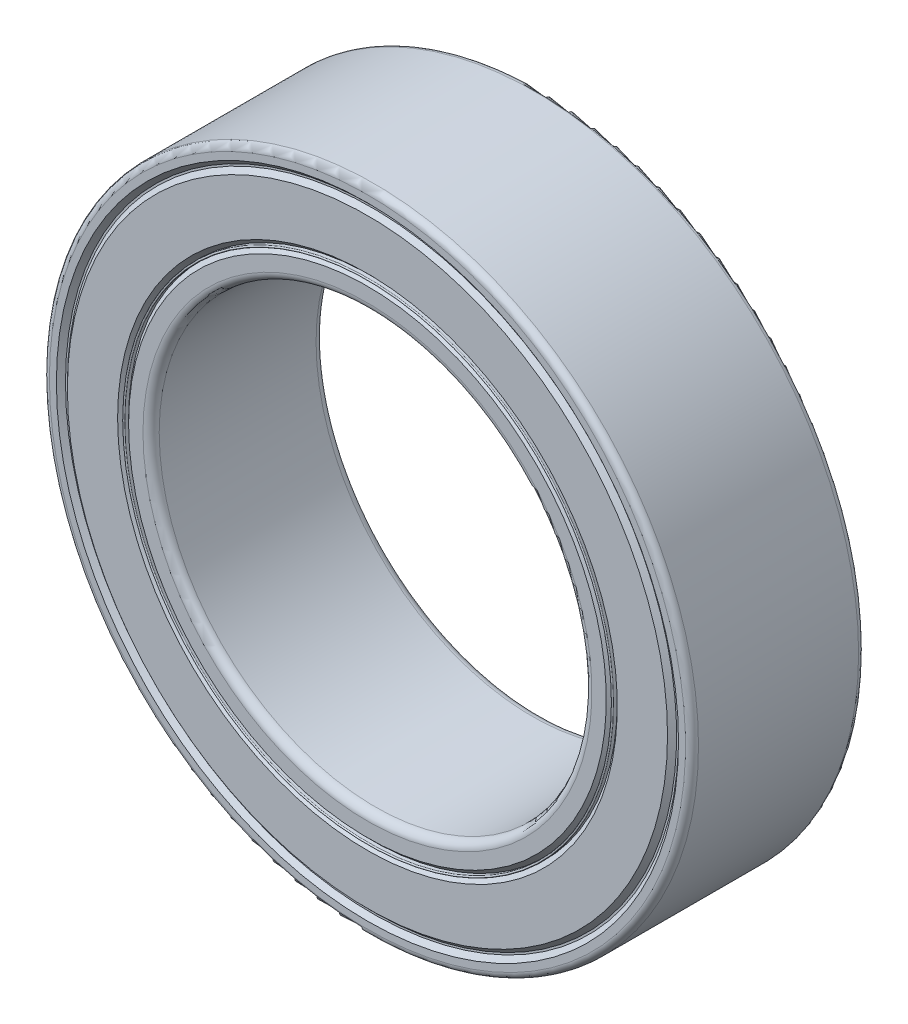
ISO-10303-21;
HEADER;
FILE_DESCRIPTION(('STEP AP214'),'2;1');
FILE_NAME('part.step','',(''),(''),'','','');
FILE_SCHEMA(('AUTOMOTIVE_DESIGN { 1 0 10303 214 1 1 1 1 }'));
ENDSEC;
DATA;
#1=APPLICATION_CONTEXT('core data for automotive mechanical design processes');
#2=APPLICATION_PROTOCOL_DEFINITION('international standard','automotive_design',2000,#1);
#3=PRODUCT_CONTEXT('',#1,'mechanical');
#4=PRODUCT('Part','Part','',(#3));
#5=PRODUCT_RELATED_PRODUCT_CATEGORY('part','',(#4));
#6=PRODUCT_DEFINITION_FORMATION('','',#4);
#7=PRODUCT_DEFINITION_CONTEXT('part definition',#1,'design');
#8=PRODUCT_DEFINITION('design','',#6,#7);
#9=PRODUCT_DEFINITION_SHAPE('','',#8);
#10=(LENGTH_UNIT() NAMED_UNIT(*) SI_UNIT(.MILLI.,.METRE.));
#11=(NAMED_UNIT(*) PLANE_ANGLE_UNIT() SI_UNIT($,.RADIAN.));
#12=(NAMED_UNIT(*) SI_UNIT($,.STERADIAN.) SOLID_ANGLE_UNIT());
#13=UNCERTAINTY_MEASURE_WITH_UNIT(LENGTH_MEASURE(1.E-05),#10,'distance_accuracy_value','');
#14=(GEOMETRIC_REPRESENTATION_CONTEXT(3) GLOBAL_UNCERTAINTY_ASSIGNED_CONTEXT((#13)) GLOBAL_UNIT_ASSIGNED_CONTEXT((#10,
#11,#12)) REPRESENTATION_CONTEXT('',''));
#15=CARTESIAN_POINT('',(0.,0.,0.));
#16=DIRECTION('',(0.,0.,1.));
#17=DIRECTION('',(1.,0.,0.));
#18=AXIS2_PLACEMENT_3D('',#15,#16,#17);
#19=CARTESIAN_POINT('',(0.,0.,-1.978125));
#20=DIRECTION('',(0.,0.,-1.));
#21=DIRECTION('',(-1.,0.,0.));
#22=AXIS2_PLACEMENT_3D('',#19,#20,#21);
#23=TOROIDAL_SURFACE('',#22,5.646875,0.0218750000000006);
#24=CARTESIAN_POINT('',(0.,0.,-1.978125));
#25=DIRECTION('',(0.,0.,-1.));
#26=DIRECTION('',(-1.,0.,0.));
#27=AXIS2_PLACEMENT_3D('',#24,#25,#26);
#28=CIRCLE('',#27,5.625);
#29=CARTESIAN_POINT('',(-5.625,0.,-1.978125));
#30=VERTEX_POINT('',#29);
#31=EDGE_CURVE('E68',#30,#30,#28,.T.);
#32=ORIENTED_EDGE('',*,*,#31,.F.);
#33=EDGE_LOOP('',(#32));
#34=FACE_BOUND('',#33,.T.);
#35=CARTESIAN_POINT('',(0.,0.,-1.978125));
#36=DIRECTION('',(0.,0.,-1.));
#37=DIRECTION('',(-1.,0.,0.));
#38=AXIS2_PLACEMENT_3D('',#35,#36,#37);
#39=CIRCLE('',#38,5.66875);
#40=CARTESIAN_POINT('',(-5.66875,0.,-1.978125));
#41=VERTEX_POINT('',#40);
#42=EDGE_CURVE('E11',#41,#41,#39,.T.);
#43=ORIENTED_EDGE('',*,*,#42,.T.);
#44=EDGE_LOOP('',(#43));
#45=FACE_BOUND('',#44,.T.);
#46=ADVANCED_FACE('F49',(#34,#45),#23,.T.);
#47=CARTESIAN_POINT('',(0.,0.,-2.));
#48=DIRECTION('',(0.,0.,-1.));
#49=DIRECTION('',(-1.,0.,0.));
#50=AXIS2_PLACEMENT_3D('',#47,#48,#49);
#51=CYLINDRICAL_SURFACE('',#50,5.66875);
#52=ORIENTED_EDGE('',*,*,#42,.F.);
#53=EDGE_LOOP('',(#52));
#54=FACE_BOUND('',#53,.T.);
#55=CARTESIAN_POINT('',(0.,0.,-1.895));
#56=DIRECTION('',(0.,0.,-1.));
#57=DIRECTION('',(-1.,0.,0.));
#58=AXIS2_PLACEMENT_3D('',#55,#56,#57);
#59=CIRCLE('',#58,5.66875);
#60=CARTESIAN_POINT('',(-5.66875,0.,-1.895));
#61=VERTEX_POINT('',#60);
#62=EDGE_CURVE('E60',#61,#61,#59,.T.);
#63=ORIENTED_EDGE('',*,*,#62,.T.);
#64=EDGE_LOOP('',(#63));
#65=FACE_BOUND('',#64,.T.);
#66=ADVANCED_FACE('F78',(#54,#65),#51,.T.);
#67=CARTESIAN_POINT('',(0.,-5.66875,-1.895));
#68=DIRECTION('',(0.,0.,-1.));
#69=DIRECTION('',(-1.,0.,0.));
#70=AXIS2_PLACEMENT_3D('',#67,#68,#69);
#71=PLANE('',#70);
#72=ORIENTED_EDGE('',*,*,#62,.F.);
#73=EDGE_LOOP('',(#72));
#74=FACE_BOUND('',#73,.T.);
#75=CARTESIAN_POINT('',(0.,0.,-1.895));
#76=DIRECTION('',(0.,0.,-1.));
#77=DIRECTION('',(-1.,0.,0.));
#78=AXIS2_PLACEMENT_3D('',#75,#76,#77);
#79=CIRCLE('',#78,5.625);
#80=CARTESIAN_POINT('',(-5.625,0.,-1.895));
#81=VERTEX_POINT('',#80);
#82=EDGE_CURVE('E64',#81,#81,#79,.T.);
#83=ORIENTED_EDGE('',*,*,#82,.T.);
#84=EDGE_LOOP('',(#83));
#85=FACE_BOUND('',#84,.T.);
#86=ADVANCED_FACE('F81',(#74,#85),#71,.F.);
#87=CARTESIAN_POINT('',(0.,0.,-2.));
#88=DIRECTION('',(0.,0.,-1.));
#89=DIRECTION('',(-1.,0.,0.));
#90=AXIS2_PLACEMENT_3D('',#87,#88,#89);
#91=CYLINDRICAL_SURFACE('',#90,5.625);
#92=ORIENTED_EDGE('',*,*,#82,.F.);
#93=EDGE_LOOP('',(#92));
#94=FACE_BOUND('',#93,.T.);
#95=ORIENTED_EDGE('',*,*,#31,.T.);
#96=EDGE_LOOP('',(#95));
#97=FACE_BOUND('',#96,.T.);
#98=ADVANCED_FACE('F80',(#94,#97),#91,.F.);
#99=CLOSED_SHELL('',(#46,#66,#86,#98));
#100=MANIFOLD_SOLID_BREP('B2',#99);
#101=CARTESIAN_POINT('',(0.,0.,-2.));
#102=DIRECTION('',(0.,0.,-1.));
#103=DIRECTION('',(-1.,0.,0.));
#104=AXIS2_PLACEMENT_3D('',#101,#102,#103);
#105=CYLINDRICAL_SURFACE('',#104,5.66875);
#106=CARTESIAN_POINT('',(0.,0.,1.895));
#107=DIRECTION('',(0.,0.,-1.));
#108=DIRECTION('',(-1.,0.,0.));
#109=AXIS2_PLACEMENT_3D('',#106,#107,#108);
#110=CIRCLE('',#109,5.66875);
#111=CARTESIAN_POINT('',(-5.66875,0.,1.895));
#112=VERTEX_POINT('',#111);
#113=EDGE_CURVE('E47',#112,#112,#110,.T.);
#114=ORIENTED_EDGE('',*,*,#113,.F.);
#115=EDGE_LOOP('',(#114));
#116=FACE_BOUND('',#115,.T.);
#117=CARTESIAN_POINT('',(0.,0.,1.978125));
#118=DIRECTION('',(0.,0.,-1.));
#119=DIRECTION('',(-1.,0.,0.));
#120=AXIS2_PLACEMENT_3D('',#117,#118,#119);
#121=CIRCLE('',#120,5.66875);
#122=CARTESIAN_POINT('',(-5.66875,0.,1.978125));
#123=VERTEX_POINT('',#122);
#124=EDGE_CURVE('E150',#123,#123,#121,.T.);
#125=ORIENTED_EDGE('',*,*,#124,.T.);
#126=EDGE_LOOP('',(#125));
#127=FACE_BOUND('',#126,.T.);
#128=ADVANCED_FACE('F129',(#116,#127),#105,.T.);
#129=CARTESIAN_POINT('',(0.,-5.66875,1.895));
#130=DIRECTION('',(0.,0.,1.));
#131=DIRECTION('',(1.,0.,0.));
#132=AXIS2_PLACEMENT_3D('',#129,#130,#131);
#133=PLANE('',#132);
#134=CARTESIAN_POINT('',(0.,0.,1.895));
#135=DIRECTION('',(0.,0.,-1.));
#136=DIRECTION('',(-1.,0.,0.));
#137=AXIS2_PLACEMENT_3D('',#134,#135,#136);
#138=CIRCLE('',#137,5.625);
#139=CARTESIAN_POINT('',(-5.625,0.,1.895));
#140=VERTEX_POINT('',#139);
#141=EDGE_CURVE('E134',#140,#140,#138,.T.);
#142=ORIENTED_EDGE('',*,*,#141,.F.);
#143=EDGE_LOOP('',(#142));
#144=FACE_BOUND('',#143,.T.);
#145=ORIENTED_EDGE('',*,*,#113,.T.);
#146=EDGE_LOOP('',(#145));
#147=FACE_BOUND('',#146,.T.);
#148=ADVANCED_FACE('F165',(#144,#147),#133,.F.);
#149=CARTESIAN_POINT('',(0.,0.,-2.));
#150=DIRECTION('',(0.,0.,-1.));
#151=DIRECTION('',(-1.,0.,0.));
#152=AXIS2_PLACEMENT_3D('',#149,#150,#151);
#153=CYLINDRICAL_SURFACE('',#152,5.625);
#154=CARTESIAN_POINT('',(0.,0.,1.978125));
#155=DIRECTION('',(0.,0.,-1.));
#156=DIRECTION('',(-1.,0.,0.));
#157=AXIS2_PLACEMENT_3D('',#154,#155,#156);
#158=CIRCLE('',#157,5.625);
#159=CARTESIAN_POINT('',(-5.625,0.,1.978125));
#160=VERTEX_POINT('',#159);
#161=EDGE_CURVE('E142',#160,#160,#158,.T.);
#162=ORIENTED_EDGE('',*,*,#161,.F.);
#163=EDGE_LOOP('',(#162));
#164=FACE_BOUND('',#163,.T.);
#165=ORIENTED_EDGE('',*,*,#141,.T.);
#166=EDGE_LOOP('',(#165));
#167=FACE_BOUND('',#166,.T.);
#168=ADVANCED_FACE('F157',(#164,#167),#153,.F.);
#169=CARTESIAN_POINT('',(0.,0.,1.978125));
#170=DIRECTION('',(0.,0.,-1.));
#171=DIRECTION('',(-1.,0.,0.));
#172=AXIS2_PLACEMENT_3D('',#169,#170,#171);
#173=TOROIDAL_SURFACE('',#172,5.646875,0.0218750000000006);
#174=ORIENTED_EDGE('',*,*,#124,.F.);
#175=EDGE_LOOP('',(#174));
#176=FACE_BOUND('',#175,.T.);
#177=ORIENTED_EDGE('',*,*,#161,.T.);
#178=EDGE_LOOP('',(#177));
#179=FACE_BOUND('',#178,.T.);
#180=ADVANCED_FACE('F158',(#176,#179),#173,.T.);
#181=CLOSED_SHELL('',(#128,#148,#168,#180));
#182=MANIFOLD_SOLID_BREP('B6',#181);
#183=CARTESIAN_POINT('',(0.,-7.03958333333334,-1.895));
#184=DIRECTION('',(0.,0.,1.));
#185=DIRECTION('',(1.,0.,0.));
#186=AXIS2_PLACEMENT_3D('',#183,#184,#185);
#187=PLANE('',#186);
#188=CARTESIAN_POINT('',(0.,0.,-1.895));
#189=DIRECTION('',(0.,0.,-1.));
#190=DIRECTION('',(-1.,0.,0.));
#191=AXIS2_PLACEMENT_3D('',#188,#189,#190);
#192=CIRCLE('',#191,7.03958333333334);
#193=CARTESIAN_POINT('',(-7.03958333333334,0.,-1.895));
#194=VERTEX_POINT('',#193);
#195=EDGE_CURVE('E243',#194,#194,#192,.T.);
#196=ORIENTED_EDGE('',*,*,#195,.F.);
#197=EDGE_LOOP('',(#196));
#198=FACE_BOUND('',#197,.T.);
#199=CARTESIAN_POINT('',(0.,0.,-1.895));
#200=DIRECTION('',(0.,0.,-1.));
#201=DIRECTION('',(-1.,0.,0.));
#202=AXIS2_PLACEMENT_3D('',#199,#200,#201);
#203=CIRCLE('',#202,7.08333333333334);
#204=CARTESIAN_POINT('',(-7.08333333333334,0.,-1.895));
#205=VERTEX_POINT('',#204);
#206=EDGE_CURVE('E130',#205,#205,#203,.T.);
#207=ORIENTED_EDGE('',*,*,#206,.T.);
#208=EDGE_LOOP('',(#207));
#209=FACE_BOUND('',#208,.T.);
#210=ADVANCED_FACE('F207',(#198,#209),#187,.F.);
#211=CARTESIAN_POINT('',(0.,0.,-2.));
#212=DIRECTION('',(0.,0.,-1.));
#213=DIRECTION('',(-1.,0.,0.));
#214=AXIS2_PLACEMENT_3D('',#211,#212,#213);
#215=CYLINDRICAL_SURFACE('',#214,7.08333333333334);
#216=ORIENTED_EDGE('',*,*,#206,.F.);
#217=EDGE_LOOP('',(#216));
#218=FACE_BOUND('',#217,.T.);
#219=CARTESIAN_POINT('',(0.,0.,-0.875000000000002));
#220=DIRECTION('',(0.,0.,-1.));
#221=DIRECTION('',(-1.,0.,0.));
#222=AXIS2_PLACEMENT_3D('',#219,#220,#221);
#223=CIRCLE('',#222,7.08333333333334);
#224=CARTESIAN_POINT('',(-7.08333333333334,0.,-0.875000000000002));
#225=VERTEX_POINT('',#224);
#226=EDGE_CURVE('E214',#225,#225,#223,.T.);
#227=ORIENTED_EDGE('',*,*,#226,.T.);
#228=EDGE_LOOP('',(#227));
#229=FACE_BOUND('',#228,.T.);
#230=ADVANCED_FACE('F255',(#218,#229),#215,.T.);
#231=CARTESIAN_POINT('',(0.,-7.08333333333334,-0.875000000000002));
#232=DIRECTION('',(0.,0.,-1.));
#233=DIRECTION('',(-1.,0.,0.));
#234=AXIS2_PLACEMENT_3D('',#231,#232,#233);
#235=PLANE('',#234);
#236=ORIENTED_EDGE('',*,*,#226,.F.);
#237=EDGE_LOOP('',(#236));
#238=FACE_BOUND('',#237,.T.);
#239=CARTESIAN_POINT('',(0.,0.,-0.875000000000002));
#240=DIRECTION('',(0.,0.,-1.));
#241=DIRECTION('',(-1.,0.,0.));
#242=AXIS2_PLACEMENT_3D('',#239,#240,#241);
#243=CIRCLE('',#242,5.625);
#244=CARTESIAN_POINT('',(-5.625,0.,-0.875000000000002));
#245=VERTEX_POINT('',#244);
#246=EDGE_CURVE('E218',#245,#245,#243,.T.);
#247=ORIENTED_EDGE('',*,*,#246,.T.);
#248=EDGE_LOOP('',(#247));
#249=FACE_BOUND('',#248,.T.);
#250=ADVANCED_FACE('F257',(#238,#249),#235,.F.);
#251=CARTESIAN_POINT('',(0.,0.,-2.));
#252=DIRECTION('',(0.,0.,-1.));
#253=DIRECTION('',(-1.,0.,0.));
#254=AXIS2_PLACEMENT_3D('',#251,#252,#253);
#255=CYLINDRICAL_SURFACE('',#254,5.625);
#256=ORIENTED_EDGE('',*,*,#246,.F.);
#257=EDGE_LOOP('',(#256));
#258=FACE_BOUND('',#257,.T.);
#259=CARTESIAN_POINT('',(0.,0.,-1.895));
#260=DIRECTION('',(0.,0.,-1.));
#261=DIRECTION('',(-1.,0.,0.));
#262=AXIS2_PLACEMENT_3D('',#259,#260,#261);
#263=CIRCLE('',#262,5.625);
#264=CARTESIAN_POINT('',(-5.625,0.,-1.895));
#265=VERTEX_POINT('',#264);
#266=EDGE_CURVE('E224',#265,#265,#263,.T.);
#267=ORIENTED_EDGE('',*,*,#266,.T.);
#268=EDGE_LOOP('',(#267));
#269=FACE_BOUND('',#268,.T.);
#270=ADVANCED_FACE('F261',(#258,#269),#255,.F.);
#271=CARTESIAN_POINT('',(0.,-5.66875,-1.895));
#272=DIRECTION('',(0.,0.,1.));
#273=DIRECTION('',(1.,0.,0.));
#274=AXIS2_PLACEMENT_3D('',#271,#272,#273);
#275=PLANE('',#274);
#276=ORIENTED_EDGE('',*,*,#266,.F.);
#277=EDGE_LOOP('',(#276));
#278=FACE_BOUND('',#277,.T.);
#279=CARTESIAN_POINT('',(0.,0.,-1.895));
#280=DIRECTION('',(0.,0.,-1.));
#281=DIRECTION('',(-1.,0.,0.));
#282=AXIS2_PLACEMENT_3D('',#279,#280,#281);
#283=CIRCLE('',#282,5.66875);
#284=CARTESIAN_POINT('',(-5.66875,0.,-1.895));
#285=VERTEX_POINT('',#284);
#286=EDGE_CURVE('E233',#285,#285,#283,.T.);
#287=ORIENTED_EDGE('',*,*,#286,.T.);
#288=EDGE_LOOP('',(#287));
#289=FACE_BOUND('',#288,.T.);
#290=ADVANCED_FACE('F270',(#278,#289),#275,.F.);
#291=CARTESIAN_POINT('',(0.,0.,-2.));
#292=DIRECTION('',(0.,0.,-1.));
#293=DIRECTION('',(-1.,0.,0.));
#294=AXIS2_PLACEMENT_3D('',#291,#292,#293);
#295=CONICAL_SURFACE('',#294,5.77375000000001,0.785398163397459);
#296=ORIENTED_EDGE('',*,*,#286,.F.);
#297=EDGE_LOOP('',(#296));
#298=FACE_BOUND('',#297,.T.);
#299=CARTESIAN_POINT('',(0.,0.,-2.));
#300=DIRECTION('',(0.,0.,-1.));
#301=DIRECTION('',(-1.,0.,0.));
#302=AXIS2_PLACEMENT_3D('',#299,#300,#301);
#303=CIRCLE('',#302,5.77375000000001);
#304=CARTESIAN_POINT('',(-5.77375000000001,0.,-2.));
#305=VERTEX_POINT('',#304);
#306=EDGE_CURVE('E232',#305,#305,#303,.T.);
#307=ORIENTED_EDGE('',*,*,#306,.T.);
#308=EDGE_LOOP('',(#307));
#309=FACE_BOUND('',#308,.T.);
#310=ADVANCED_FACE('F272',(#298,#309),#295,.F.);
#311=CARTESIAN_POINT('',(0.,-5.77375000000001,-2.));
#312=DIRECTION('',(0.,0.,1.));
#313=DIRECTION('',(1.,0.,0.));
#314=AXIS2_PLACEMENT_3D('',#311,#312,#313);
#315=PLANE('',#314);
#316=ORIENTED_EDGE('',*,*,#306,.F.);
#317=EDGE_LOOP('',(#316));
#318=FACE_BOUND('',#317,.T.);
#319=CARTESIAN_POINT('',(0.,0.,-2.));
#320=DIRECTION('',(0.,0.,-1.));
#321=DIRECTION('',(-1.,0.,0.));
#322=AXIS2_PLACEMENT_3D('',#319,#320,#321);
#323=CIRCLE('',#322,6.93458333333334);
#324=CARTESIAN_POINT('',(-6.93458333333334,0.,-2.));
#325=VERTEX_POINT('',#324);
#326=EDGE_CURVE('E237',#325,#325,#323,.T.);
#327=ORIENTED_EDGE('',*,*,#326,.T.);
#328=EDGE_LOOP('',(#327));
#329=FACE_BOUND('',#328,.T.);
#330=ADVANCED_FACE('F273',(#318,#329),#315,.F.);
#331=CARTESIAN_POINT('',(0.,0.,-1.895));
#332=DIRECTION('',(0.,0.,1.));
#333=DIRECTION('',(1.,0.,0.));
#334=AXIS2_PLACEMENT_3D('',#331,#332,#333);
#335=CONICAL_SURFACE('',#334,7.03958333333334,0.785398163397434);
#336=ORIENTED_EDGE('',*,*,#326,.F.);
#337=EDGE_LOOP('',(#336));
#338=FACE_BOUND('',#337,.T.);
#339=ORIENTED_EDGE('',*,*,#195,.T.);
#340=EDGE_LOOP('',(#339));
#341=FACE_BOUND('',#340,.T.);
#342=ADVANCED_FACE('F248',(#338,#341),#335,.T.);
#343=CLOSED_SHELL('',(#210,#230,#250,#270,#290,#310,#330,#342));
#344=MANIFOLD_SOLID_BREP('B42',#343);
#345=CARTESIAN_POINT('',(0.,0.,1.895));
#346=DIRECTION('',(0.,0.,1.));
#347=DIRECTION('',(1.,0.,0.));
#348=AXIS2_PLACEMENT_3D('',#345,#346,#347);
#349=CONICAL_SURFACE('',#348,5.66875,0.785398163397461);
#350=CARTESIAN_POINT('',(0.,0.,2.));
#351=DIRECTION('',(0.,0.,-1.));
#352=DIRECTION('',(-1.,0.,0.));
#353=AXIS2_PLACEMENT_3D('',#350,#351,#352);
#354=CIRCLE('',#353,5.77375000000001);
#355=CARTESIAN_POINT('',(-5.77375000000001,0.,2.));
#356=VERTEX_POINT('',#355);
#357=EDGE_CURVE('E390',#356,#356,#354,.T.);
#358=ORIENTED_EDGE('',*,*,#357,.F.);
#359=EDGE_LOOP('',(#358));
#360=FACE_BOUND('',#359,.T.);
#361=CARTESIAN_POINT('',(0.,0.,1.895));
#362=DIRECTION('',(0.,0.,-1.));
#363=DIRECTION('',(-1.,0.,0.));
#364=AXIS2_PLACEMENT_3D('',#361,#362,#363);
#365=CIRCLE('',#364,5.66875);
#366=CARTESIAN_POINT('',(-5.66875,0.,1.895));
#367=VERTEX_POINT('',#366);
#368=EDGE_CURVE('E201',#367,#367,#365,.T.);
#369=ORIENTED_EDGE('',*,*,#368,.T.);
#370=EDGE_LOOP('',(#369));
#371=FACE_BOUND('',#370,.T.);
#372=ADVANCED_FACE('F349',(#360,#371),#349,.F.);
#373=CARTESIAN_POINT('',(0.,-5.66875,1.895));
#374=DIRECTION('',(0.,0.,-1.));
#375=DIRECTION('',(-1.,0.,0.));
#376=AXIS2_PLACEMENT_3D('',#373,#374,#375);
#377=PLANE('',#376);
#378=ORIENTED_EDGE('',*,*,#368,.F.);
#379=EDGE_LOOP('',(#378));
#380=FACE_BOUND('',#379,.T.);
#381=CARTESIAN_POINT('',(0.,0.,1.895));
#382=DIRECTION('',(0.,0.,-1.));
#383=DIRECTION('',(-1.,0.,0.));
#384=AXIS2_PLACEMENT_3D('',#381,#382,#383);
#385=CIRCLE('',#384,5.625);
#386=CARTESIAN_POINT('',(-5.625,0.,1.895));
#387=VERTEX_POINT('',#386);
#388=EDGE_CURVE('E357',#387,#387,#385,.T.);
#389=ORIENTED_EDGE('',*,*,#388,.T.);
#390=EDGE_LOOP('',(#389));
#391=FACE_BOUND('',#390,.T.);
#392=ADVANCED_FACE('F397',(#380,#391),#377,.F.);
#393=CARTESIAN_POINT('',(0.,0.,-2.));
#394=DIRECTION('',(0.,0.,-1.));
#395=DIRECTION('',(-1.,0.,0.));
#396=AXIS2_PLACEMENT_3D('',#393,#394,#395);
#397=CYLINDRICAL_SURFACE('',#396,5.625);
#398=ORIENTED_EDGE('',*,*,#388,.F.);
#399=EDGE_LOOP('',(#398));
#400=FACE_BOUND('',#399,.T.);
#401=CARTESIAN_POINT('',(0.,0.,0.875000000000002));
#402=DIRECTION('',(0.,0.,-1.));
#403=DIRECTION('',(-1.,0.,0.));
#404=AXIS2_PLACEMENT_3D('',#401,#402,#403);
#405=CIRCLE('',#404,5.625);
#406=CARTESIAN_POINT('',(-5.625,0.,0.875000000000002));
#407=VERTEX_POINT('',#406);
#408=EDGE_CURVE('E361',#407,#407,#405,.T.);
#409=ORIENTED_EDGE('',*,*,#408,.T.);
#410=EDGE_LOOP('',(#409));
#411=FACE_BOUND('',#410,.T.);
#412=ADVANCED_FACE('F396',(#400,#411),#397,.F.);
#413=CARTESIAN_POINT('',(0.,-7.08333333333334,0.875000000000002));
#414=DIRECTION('',(0.,0.,1.));
#415=DIRECTION('',(1.,0.,0.));
#416=AXIS2_PLACEMENT_3D('',#413,#414,#415);
#417=PLANE('',#416);
#418=ORIENTED_EDGE('',*,*,#408,.F.);
#419=EDGE_LOOP('',(#418));
#420=FACE_BOUND('',#419,.T.);
#421=CARTESIAN_POINT('',(0.,0.,0.875000000000002));
#422=DIRECTION('',(0.,0.,-1.));
#423=DIRECTION('',(-1.,0.,0.));
#424=AXIS2_PLACEMENT_3D('',#421,#422,#423);
#425=CIRCLE('',#424,7.08333333333334);
#426=CARTESIAN_POINT('',(-7.08333333333334,0.,0.875000000000002));
#427=VERTEX_POINT('',#426);
#428=EDGE_CURVE('E367',#427,#427,#425,.T.);
#429=ORIENTED_EDGE('',*,*,#428,.T.);
#430=EDGE_LOOP('',(#429));
#431=FACE_BOUND('',#430,.T.);
#432=ADVANCED_FACE('F403',(#420,#431),#417,.F.);
#433=CARTESIAN_POINT('',(0.,0.,-2.));
#434=DIRECTION('',(0.,0.,-1.));
#435=DIRECTION('',(-1.,0.,0.));
#436=AXIS2_PLACEMENT_3D('',#433,#434,#435);
#437=CYLINDRICAL_SURFACE('',#436,7.08333333333334);
#438=ORIENTED_EDGE('',*,*,#428,.F.);
#439=EDGE_LOOP('',(#438));
#440=FACE_BOUND('',#439,.T.);
#441=CARTESIAN_POINT('',(0.,0.,1.895));
#442=DIRECTION('',(0.,0.,-1.));
#443=DIRECTION('',(-1.,0.,0.));
#444=AXIS2_PLACEMENT_3D('',#441,#442,#443);
#445=CIRCLE('',#444,7.08333333333334);
#446=CARTESIAN_POINT('',(-7.08333333333334,0.,1.895));
#447=VERTEX_POINT('',#446);
#448=EDGE_CURVE('E374',#447,#447,#445,.T.);
#449=ORIENTED_EDGE('',*,*,#448,.T.);
#450=EDGE_LOOP('',(#449));
#451=FACE_BOUND('',#450,.T.);
#452=ADVANCED_FACE('F411',(#440,#451),#437,.T.);
#453=CARTESIAN_POINT('',(0.,-7.03958333333334,1.895));
#454=DIRECTION('',(0.,0.,-1.));
#455=DIRECTION('',(-1.,0.,0.));
#456=AXIS2_PLACEMENT_3D('',#453,#454,#455);
#457=PLANE('',#456);
#458=ORIENTED_EDGE('',*,*,#448,.F.);
#459=EDGE_LOOP('',(#458));
#460=FACE_BOUND('',#459,.T.);
#461=CARTESIAN_POINT('',(0.,0.,1.895));
#462=DIRECTION('',(0.,0.,-1.));
#463=DIRECTION('',(-1.,0.,0.));
#464=AXIS2_PLACEMENT_3D('',#461,#462,#463);
#465=CIRCLE('',#464,7.03958333333334);
#466=CARTESIAN_POINT('',(-7.03958333333334,0.,1.895));
#467=VERTEX_POINT('',#466);
#468=EDGE_CURVE('E378',#467,#467,#465,.T.);
#469=ORIENTED_EDGE('',*,*,#468,.T.);
#470=EDGE_LOOP('',(#469));
#471=FACE_BOUND('',#470,.T.);
#472=ADVANCED_FACE('F414',(#460,#471),#457,.F.);
#473=CARTESIAN_POINT('',(0.,0.,2.));
#474=DIRECTION('',(0.,0.,-1.));
#475=DIRECTION('',(-1.,0.,0.));
#476=AXIS2_PLACEMENT_3D('',#473,#474,#475);
#477=CONICAL_SURFACE('',#476,6.93458333333334,0.785398163397436);
#478=ORIENTED_EDGE('',*,*,#468,.F.);
#479=EDGE_LOOP('',(#478));
#480=FACE_BOUND('',#479,.T.);
#481=CARTESIAN_POINT('',(0.,0.,2.));
#482=DIRECTION('',(0.,0.,-1.));
#483=DIRECTION('',(-1.,0.,0.));
#484=AXIS2_PLACEMENT_3D('',#481,#482,#483);
#485=CIRCLE('',#484,6.93458333333334);
#486=CARTESIAN_POINT('',(-6.93458333333334,0.,2.));
#487=VERTEX_POINT('',#486);
#488=EDGE_CURVE('E384',#487,#487,#485,.T.);
#489=ORIENTED_EDGE('',*,*,#488,.T.);
#490=EDGE_LOOP('',(#489));
#491=FACE_BOUND('',#490,.T.);
#492=ADVANCED_FACE('F417',(#480,#491),#477,.T.);
#493=CARTESIAN_POINT('',(0.,-5.77375000000001,2.));
#494=DIRECTION('',(0.,0.,-1.));
#495=DIRECTION('',(-1.,0.,0.));
#496=AXIS2_PLACEMENT_3D('',#493,#494,#495);
#497=PLANE('',#496);
#498=ORIENTED_EDGE('',*,*,#488,.F.);
#499=EDGE_LOOP('',(#498));
#500=FACE_BOUND('',#499,.T.);
#501=ORIENTED_EDGE('',*,*,#357,.T.);
#502=EDGE_LOOP('',(#501));
#503=FACE_BOUND('',#502,.T.);
#504=ADVANCED_FACE('F392',(#500,#503),#497,.F.);
#505=CLOSED_SHELL('',(#372,#392,#412,#432,#452,#472,#492,#504));
#506=MANIFOLD_SOLID_BREP('B125',#505);
#507=CARTESIAN_POINT('',(2.58447241954408,-5.8048200954374,0.));
#508=DIRECTION('',(-0.406736643075789,0.913545457642606,0.));
#509=DIRECTION('',(0.,0.,-1.));
#510=AXIS2_PLACEMENT_3D('',#507,#508,#509);
#511=SPHERICAL_SURFACE('',#510,0.875000000000003);
#512=CARTESIAN_POINT('',(2.22857785685276,-5.00546782000011,0.));
#513=VERTEX_POINT('',#512);
#514=VERTEX_LOOP('',#513);
#515=FACE_BOUND('',#514,.T.);
#516=ADVANCED_FACE('F494',(#515),#511,.T.);
#517=CLOSED_SHELL('',(#516));
#518=MANIFOLD_SOLID_BREP('B199',#517);
#519=CARTESIAN_POINT('',(4.72206607855423,-4.25176739457197,0.));
#520=DIRECTION('',(-0.743144825477386,0.669130606358867,0.));
#521=DIRECTION('',(0.,0.,-1.));
#522=AXIS2_PLACEMENT_3D('',#519,#520,#521);
#523=SPHERICAL_SURFACE('',#522,0.875000000000003);
#524=CARTESIAN_POINT('',(4.07181435626151,-3.66627811400796,0.));
#525=VERTEX_POINT('',#524);
#526=VERTEX_LOOP('',#525);
#527=FACE_BOUND('',#526,.T.);
#528=ADVANCED_FACE('F514',(#527),#523,.T.);
#529=CLOSED_SHELL('',(#528));
#530=MANIFOLD_SOLID_BREP('B346',#529);
#531=CARTESIAN_POINT('',(6.04317161395877,-1.96354548509088,0.));
#532=DIRECTION('',(-0.95105651629515,0.309016994374957,0.));
#533=DIRECTION('',(0.,0.,-1.));
#534=AXIS2_PLACEMENT_3D('',#531,#532,#533);
#535=SPHERICAL_SURFACE('',#534,0.875000000000003);
#536=CARTESIAN_POINT('',(5.21099716220051,-1.69315561501279,0.));
#537=VERTEX_POINT('',#536);
#538=VERTEX_LOOP('',#537);
#539=FACE_BOUND('',#538,.T.);
#540=ADVANCED_FACE('F535',(#539),#535,.T.);
#541=CLOSED_SHELL('',(#540));
#542=MANIFOLD_SOLID_BREP('B489',#541);
#543=CARTESIAN_POINT('',(6.31935787681925,0.664191277013153,0.));
#544=DIRECTION('',(-0.994521895368274,-0.104528463267644,0.));
#545=DIRECTION('',(0.,0.,-1.));
#546=AXIS2_PLACEMENT_3D('',#543,#544,#545);
#547=SPHERICAL_SURFACE('',#546,0.875000000000003);
#548=CARTESIAN_POINT('',(5.449151218372,0.572728871653964,0.));
#549=VERTEX_POINT('',#548);
#550=VERTEX_LOOP('',#549);
#551=FACE_BOUND('',#550,.T.);
#552=ADVANCED_FACE('F553',(#551),#547,.T.);
#553=CLOSED_SHELL('',(#552));
#554=MANIFOLD_SOLID_BREP('B508',#553);
#555=CARTESIAN_POINT('',(5.50286975321365,3.17708333333328,0.));
#556=DIRECTION('',(-0.866025403784443,-0.499999999999992,0.));
#557=DIRECTION('',(0.,0.,-1.));
#558=AXIS2_PLACEMENT_3D('',#555,#556,#557);
#559=SPHERICAL_SURFACE('',#558,0.875000000000003);
#560=CARTESIAN_POINT('',(4.74509752490226,2.73958333333329,0.));
#561=VERTEX_POINT('',#560);
#562=VERTEX_LOOP('',#561);
#563=FACE_BOUND('',#562,.T.);
#564=ADVANCED_FACE('F569',(#563),#559,.T.);
#565=CLOSED_SHELL('',(#564));
#566=MANIFOLD_SOLID_BREP('B528',#565);
#567=CARTESIAN_POINT('',(3.73488545727513,5.14062881842412,0.));
#568=DIRECTION('',(-0.58778525229248,-0.809016994374943,0.));
#569=DIRECTION('',(0.,0.,-1.));
#570=AXIS2_PLACEMENT_3D('',#567,#568,#569);
#571=SPHERICAL_SURFACE('',#570,0.875000000000003);
#572=CARTESIAN_POINT('',(3.22057336151921,4.43273894834604,0.));
#573=VERTEX_POINT('',#572);
#574=VERTEX_LOOP('',#573);
#575=FACE_BOUND('',#574,.T.);
#576=ADVANCED_FACE('F588',(#575),#571,.T.);
#577=CLOSED_SHELL('',(#576));
#578=MANIFOLD_SOLID_BREP('B550',#577);
#579=CARTESIAN_POINT('',(1.32110553540456,6.21531287966272,0.));
#580=DIRECTION('',(-0.207911690817766,-0.978147600733804,0.));
#581=DIRECTION('',(0.,0.,-1.));
#582=AXIS2_PLACEMENT_3D('',#579,#580,#581);
#583=SPHERICAL_SURFACE('',#582,0.875000000000003);
#584=CARTESIAN_POINT('',(1.13918280593901,5.35943372902064,0.));
#585=VERTEX_POINT('',#584);
#586=VERTEX_LOOP('',#585);
#587=FACE_BOUND('',#586,.T.);
#588=ADVANCED_FACE('F607',(#587),#583,.T.);
#589=CLOSED_SHELL('',(#588));
#590=MANIFOLD_SOLID_BREP('B566',#589);
#591=CARTESIAN_POINT('',(-1.32110553540447,6.21531287966273,0.));
#592=DIRECTION('',(0.207911690817753,-0.978147600733807,0.));
#593=DIRECTION('',(0.,0.,-1.));
#594=AXIS2_PLACEMENT_3D('',#591,#592,#593);
#595=SPHERICAL_SURFACE('',#594,0.875000000000003);
#596=CARTESIAN_POINT('',(-1.13918280593894,5.35943372902065,0.));
#597=VERTEX_POINT('',#596);
#598=VERTEX_LOOP('',#597);
#599=FACE_BOUND('',#598,.T.);
#600=ADVANCED_FACE('F630',(#599),#595,.T.);
#601=CLOSED_SHELL('',(#600));
#602=MANIFOLD_SOLID_BREP('B583',#601);
#603=CARTESIAN_POINT('',(-3.73488545727506,5.14062881842417,0.));
#604=DIRECTION('',(0.587785252292469,-0.80901699437495,0.));
#605=DIRECTION('',(0.,0.,-1.));
#606=AXIS2_PLACEMENT_3D('',#603,#604,#605);
#607=SPHERICAL_SURFACE('',#606,0.875000000000003);
#608=CARTESIAN_POINT('',(-3.22057336151915,4.43273894834608,0.));
#609=VERTEX_POINT('',#608);
#610=VERTEX_LOOP('',#609);
#611=FACE_BOUND('',#610,.T.);
#612=ADVANCED_FACE('F647',(#611),#607,.T.);
#613=CLOSED_SHELL('',(#612));
#614=MANIFOLD_SOLID_BREP('B601',#613);
#615=CARTESIAN_POINT('',(-5.50286975321361,3.17708333333336,0.));
#616=DIRECTION('',(0.866025403784436,-0.500000000000004,0.));
#617=DIRECTION('',(0.,0.,-1.));
#618=AXIS2_PLACEMENT_3D('',#615,#616,#617);
#619=SPHERICAL_SURFACE('',#618,0.875000000000003);
#620=CARTESIAN_POINT('',(-4.74509752490222,2.73958333333336,0.));
#621=VERTEX_POINT('',#620);
#622=VERTEX_LOOP('',#621);
#623=FACE_BOUND('',#622,.T.);
#624=ADVANCED_FACE('F663',(#623),#619,.T.);
#625=CLOSED_SHELL('',(#624));
#626=MANIFOLD_SOLID_BREP('B621',#625);
#627=CARTESIAN_POINT('',(-6.31935787681924,0.664191277013238,0.));
#628=DIRECTION('',(0.994521895368273,-0.104528463267657,0.));
#629=DIRECTION('',(0.,0.,-1.));
#630=AXIS2_PLACEMENT_3D('',#627,#628,#629);
#631=SPHERICAL_SURFACE('',#630,0.875000000000003);
#632=CARTESIAN_POINT('',(-5.44915121837199,0.572728871654038,0.));
#633=VERTEX_POINT('',#632);
#634=VERTEX_LOOP('',#633);
#635=FACE_BOUND('',#634,.T.);
#636=ADVANCED_FACE('F685',(#635),#631,.T.);
#637=CLOSED_SHELL('',(#636));
#638=MANIFOLD_SOLID_BREP('B645',#637);
#639=CARTESIAN_POINT('',(-6.0431716139588,-1.9635454850908,0.));
#640=DIRECTION('',(0.951056516295154,0.309016994374945,0.));
#641=DIRECTION('',(0.,0.,-1.));
#642=AXIS2_PLACEMENT_3D('',#639,#640,#641);
#643=SPHERICAL_SURFACE('',#642,0.875000000000003);
#644=CARTESIAN_POINT('',(-5.21099716220053,-1.69315561501272,0.));
#645=VERTEX_POINT('',#644);
#646=VERTEX_LOOP('',#645);
#647=FACE_BOUND('',#646,.T.);
#648=ADVANCED_FACE('F702',(#647),#643,.T.);
#649=CLOSED_SHELL('',(#648));
#650=MANIFOLD_SOLID_BREP('B662',#649);
#651=CARTESIAN_POINT('',(-4.72206607855429,-4.25176739457191,0.));
#652=DIRECTION('',(0.743144825477395,0.669130606358857,0.));
#653=DIRECTION('',(0.,0.,-1.));
#654=AXIS2_PLACEMENT_3D('',#651,#652,#653);
#655=SPHERICAL_SURFACE('',#654,0.875000000000003);
#656=CARTESIAN_POINT('',(-4.07181435626156,-3.6662781140079,0.));
#657=VERTEX_POINT('',#656);
#658=VERTEX_LOOP('',#657);
#659=FACE_BOUND('',#658,.T.);
#660=ADVANCED_FACE('F725',(#659),#655,.T.);
#661=CLOSED_SHELL('',(#660));
#662=MANIFOLD_SOLID_BREP('B679',#661);
#663=CARTESIAN_POINT('',(-2.58447241954415,-5.80482009543736,0.));
#664=DIRECTION('',(0.406736643075801,0.913545457642601,0.));
#665=DIRECTION('',(0.,0.,-1.));
#666=AXIS2_PLACEMENT_3D('',#663,#664,#665);
#667=SPHERICAL_SURFACE('',#666,0.875000000000003);
#668=CARTESIAN_POINT('',(-2.22857785685283,-5.00546782000008,0.));
#669=VERTEX_POINT('',#668);
#670=VERTEX_LOOP('',#669);
#671=FACE_BOUND('',#670,.T.);
#672=ADVANCED_FACE('F743',(#671),#667,.T.);
#673=CLOSED_SHELL('',(#672));
#674=MANIFOLD_SOLID_BREP('B697',#673);
#675=CARTESIAN_POINT('',(0.,-6.35416666666667,0.));
#676=DIRECTION('',(0.,1.,0.));
#677=DIRECTION('',(0.,0.,-1.));
#678=AXIS2_PLACEMENT_3D('',#675,#676,#677);
#679=SPHERICAL_SURFACE('',#678,0.875000000000003);
#680=CARTESIAN_POINT('',(0.,-5.47916666666667,0.));
#681=VERTEX_POINT('',#680);
#682=VERTEX_LOOP('',#681);
#683=FACE_BOUND('',#682,.T.);
#684=ADVANCED_FACE('F765',(#683),#679,.T.);
#685=CLOSED_SHELL('',(#684));
#686=MANIFOLD_SOLID_BREP('B717',#685);
#687=CARTESIAN_POINT('',(0.,0.,-2.));
#688=DIRECTION('',(0.,0.,-1.));
#689=DIRECTION('',(-1.,0.,0.));
#690=AXIS2_PLACEMENT_3D('',#687,#688,#689);
#691=CYLINDRICAL_SURFACE('',#690,5.625);
#692=CARTESIAN_POINT('',(0.,0.,-1.895));
#693=DIRECTION('',(0.,0.,1.));
#694=DIRECTION('',(1.,0.,0.));
#695=AXIS2_PLACEMENT_3D('',#692,#693,#694);
#696=CIRCLE('',#695,5.625);
#697=CARTESIAN_POINT('',(5.625,0.,-1.895));
#698=VERTEX_POINT('',#697);
#699=EDGE_CURVE('E797',#698,#698,#696,.T.);
#700=ORIENTED_EDGE('',*,*,#699,.T.);
#701=EDGE_LOOP('',(#700));
#702=FACE_BOUND('',#701,.T.);
#703=CARTESIAN_POINT('',(0.,0.,-0.483674448593496));
#704=DIRECTION('',(0.,0.,1.));
#705=DIRECTION('',(1.,0.,0.));
#706=AXIS2_PLACEMENT_3D('',#703,#704,#705);
#707=CIRCLE('',#706,5.625);
#708=CARTESIAN_POINT('',(5.625,0.,-0.483674448593496));
#709=VERTEX_POINT('',#708);
#710=EDGE_CURVE('E822',#709,#709,#707,.T.);
#711=ORIENTED_EDGE('',*,*,#710,.F.);
#712=EDGE_LOOP('',(#711));
#713=FACE_BOUND('',#712,.T.);
#714=ADVANCED_FACE('F785',(#702,#713),#691,.T.);
#715=CARTESIAN_POINT('',(0.,0.,1.895));
#716=DIRECTION('',(0.,0.,-1.));
#717=DIRECTION('',(-1.,0.,0.));
#718=AXIS2_PLACEMENT_3D('',#715,#716,#717);
#719=CIRCLE('',#718,5.625);
#720=CARTESIAN_POINT('',(-5.625,0.,1.895));
#721=VERTEX_POINT('',#720);
#722=EDGE_CURVE('E786',#721,#721,#719,.T.);
#723=ORIENTED_EDGE('',*,*,#722,.T.);
#724=EDGE_LOOP('',(#723));
#725=FACE_BOUND('',#724,.T.);
#726=CARTESIAN_POINT('',(0.,0.,0.483674448593496));
#727=DIRECTION('',(0.,0.,-1.));
#728=DIRECTION('',(-1.,0.,0.));
#729=AXIS2_PLACEMENT_3D('',#726,#727,#728);
#730=CIRCLE('',#729,5.625);
#731=CARTESIAN_POINT('',(-5.625,0.,0.483674448593496));
#732=VERTEX_POINT('',#731);
#733=EDGE_CURVE('E828',#732,#732,#730,.T.);
#734=ORIENTED_EDGE('',*,*,#733,.F.);
#735=EDGE_LOOP('',(#734));
#736=FACE_BOUND('',#735,.T.);
#737=ADVANCED_FACE('F840',(#725,#736),#691,.T.);
#738=CARTESIAN_POINT('',(0.,-5.625,2.));
#739=DIRECTION('',(0.,0.,-1.));
#740=DIRECTION('',(-1.,0.,0.));
#741=AXIS2_PLACEMENT_3D('',#738,#739,#740);
#742=PLANE('',#741);
#743=CARTESIAN_POINT('',(0.,0.,2.));
#744=DIRECTION('',(0.,0.,-1.));
#745=DIRECTION('',(-1.,0.,0.));
#746=AXIS2_PLACEMENT_3D('',#743,#744,#745);
#747=CIRCLE('',#746,5.52);
#748=CARTESIAN_POINT('',(-5.52,0.,2.));
#749=VERTEX_POINT('',#748);
#750=EDGE_CURVE('E761',#749,#749,#747,.F.);
#751=ORIENTED_EDGE('',*,*,#750,.T.);
#752=EDGE_LOOP('',(#751));
#753=FACE_BOUND('',#752,.T.);
#754=CARTESIAN_POINT('',(0.,0.,2.));
#755=DIRECTION('',(0.,0.,-1.));
#756=DIRECTION('',(-1.,0.,0.));
#757=AXIS2_PLACEMENT_3D('',#754,#755,#756);
#758=CIRCLE('',#757,5.1875);
#759=CARTESIAN_POINT('',(-5.1875,0.,2.));
#760=VERTEX_POINT('',#759);
#761=EDGE_CURVE('E806',#760,#760,#758,.T.);
#762=ORIENTED_EDGE('',*,*,#761,.T.);
#763=EDGE_LOOP('',(#762));
#764=FACE_BOUND('',#763,.T.);
#765=ADVANCED_FACE('F836',(#753,#764),#742,.F.);
#766=CARTESIAN_POINT('',(0.,0.,-2.));
#767=DIRECTION('',(0.,0.,-1.));
#768=DIRECTION('',(-1.,0.,0.));
#769=AXIS2_PLACEMENT_3D('',#766,#767,#768);
#770=CYLINDRICAL_SURFACE('',#769,5.);
#771=CARTESIAN_POINT('',(0.,0.,-1.8125));
#772=DIRECTION('',(0.,0.,1.));
#773=DIRECTION('',(1.,0.,0.));
#774=AXIS2_PLACEMENT_3D('',#771,#772,#773);
#775=CIRCLE('',#774,5.);
#776=CARTESIAN_POINT('',(5.,0.,-1.8125));
#777=VERTEX_POINT('',#776);
#778=EDGE_CURVE('E818',#777,#777,#775,.F.);
#779=ORIENTED_EDGE('',*,*,#778,.T.);
#780=EDGE_LOOP('',(#779));
#781=FACE_BOUND('',#780,.T.);
#782=CARTESIAN_POINT('',(0.,0.,1.8125));
#783=DIRECTION('',(0.,0.,-1.));
#784=DIRECTION('',(-1.,0.,0.));
#785=AXIS2_PLACEMENT_3D('',#782,#783,#784);
#786=CIRCLE('',#785,5.);
#787=CARTESIAN_POINT('',(-5.,0.,1.8125));
#788=VERTEX_POINT('',#787);
#789=EDGE_CURVE('E817',#788,#788,#786,.F.);
#790=ORIENTED_EDGE('',*,*,#789,.T.);
#791=EDGE_LOOP('',(#790));
#792=FACE_BOUND('',#791,.T.);
#793=ADVANCED_FACE('F843',(#781,#792),#770,.F.);
#794=CARTESIAN_POINT('',(0.,-5.625,-2.));
#795=DIRECTION('',(0.,0.,1.));
#796=DIRECTION('',(1.,0.,0.));
#797=AXIS2_PLACEMENT_3D('',#794,#795,#796);
#798=PLANE('',#797);
#799=CARTESIAN_POINT('',(0.,0.,-2.));
#800=DIRECTION('',(0.,0.,1.));
#801=DIRECTION('',(1.,0.,0.));
#802=AXIS2_PLACEMENT_3D('',#799,#800,#801);
#803=CIRCLE('',#802,5.52);
#804=CARTESIAN_POINT('',(5.52,0.,-2.));
#805=VERTEX_POINT('',#804);
#806=EDGE_CURVE('E805',#805,#805,#803,.F.);
#807=ORIENTED_EDGE('',*,*,#806,.T.);
#808=EDGE_LOOP('',(#807));
#809=FACE_BOUND('',#808,.T.);
#810=CARTESIAN_POINT('',(0.,0.,-2.));
#811=DIRECTION('',(0.,0.,1.));
#812=DIRECTION('',(1.,0.,0.));
#813=AXIS2_PLACEMENT_3D('',#810,#811,#812);
#814=CIRCLE('',#813,5.1875);
#815=CARTESIAN_POINT('',(5.1875,0.,-2.));
#816=VERTEX_POINT('',#815);
#817=EDGE_CURVE('E812',#816,#816,#814,.T.);
#818=ORIENTED_EDGE('',*,*,#817,.T.);
#819=EDGE_LOOP('',(#818));
#820=FACE_BOUND('',#819,.T.);
#821=ADVANCED_FACE('F849',(#809,#820),#798,.F.);
#822=CARTESIAN_POINT('',(0.,0.,0.));
#823=DIRECTION('',(0.,0.,-1.));
#824=DIRECTION('',(-1.,0.,0.));
#825=AXIS2_PLACEMENT_3D('',#822,#823,#824);
#826=TOROIDAL_SURFACE('',#825,6.35416666666667,0.875000000000002);
#827=ORIENTED_EDGE('',*,*,#733,.T.);
#828=EDGE_LOOP('',(#827));
#829=FACE_BOUND('',#828,.T.);
#830=ORIENTED_EDGE('',*,*,#710,.T.);
#831=EDGE_LOOP('',(#830));
#832=FACE_BOUND('',#831,.T.);
#833=ADVANCED_FACE('F833',(#829,#832),#826,.F.);
#834=CARTESIAN_POINT('',(0.,0.,-1.8125));
#835=DIRECTION('',(0.,0.,1.));
#836=DIRECTION('',(1.,0.,0.));
#837=AXIS2_PLACEMENT_3D('',#834,#835,#836);
#838=TOROIDAL_SURFACE('',#837,5.1875,0.1875);
#839=ORIENTED_EDGE('',*,*,#817,.F.);
#840=EDGE_LOOP('',(#839));
#841=FACE_BOUND('',#840,.T.);
#842=ORIENTED_EDGE('',*,*,#778,.F.);
#843=EDGE_LOOP('',(#842));
#844=FACE_BOUND('',#843,.T.);
#845=ADVANCED_FACE('F860',(#841,#844),#838,.T.);
#846=CARTESIAN_POINT('',(0.,0.,1.8125));
#847=DIRECTION('',(0.,0.,-1.));
#848=DIRECTION('',(-1.,0.,0.));
#849=AXIS2_PLACEMENT_3D('',#846,#847,#848);
#850=TOROIDAL_SURFACE('',#849,5.1875,0.1875);
#851=ORIENTED_EDGE('',*,*,#789,.F.);
#852=EDGE_LOOP('',(#851));
#853=FACE_BOUND('',#852,.T.);
#854=ORIENTED_EDGE('',*,*,#761,.F.);
#855=EDGE_LOOP('',(#854));
#856=FACE_BOUND('',#855,.T.);
#857=ADVANCED_FACE('F858',(#853,#856),#850,.T.);
#858=CARTESIAN_POINT('',(0.,0.,-2.));
#859=DIRECTION('',(0.,0.,1.));
#860=DIRECTION('',(1.,0.,0.));
#861=AXIS2_PLACEMENT_3D('',#858,#859,#860);
#862=CONICAL_SURFACE('',#861,5.52,0.785398163397444);
#863=ORIENTED_EDGE('',*,*,#699,.F.);
#864=EDGE_LOOP('',(#863));
#865=FACE_BOUND('',#864,.T.);
#866=ORIENTED_EDGE('',*,*,#806,.F.);
#867=EDGE_LOOP('',(#866));
#868=FACE_BOUND('',#867,.T.);
#869=ADVANCED_FACE('F864',(#865,#868),#862,.T.);
#870=CARTESIAN_POINT('',(0.,0.,1.895));
#871=DIRECTION('',(0.,0.,-1.));
#872=DIRECTION('',(-1.,0.,0.));
#873=AXIS2_PLACEMENT_3D('',#870,#871,#872);
#874=CONICAL_SURFACE('',#873,5.625,0.785398163397457);
#875=ORIENTED_EDGE('',*,*,#750,.F.);
#876=EDGE_LOOP('',(#875));
#877=FACE_BOUND('',#876,.T.);
#878=ORIENTED_EDGE('',*,*,#722,.F.);
#879=EDGE_LOOP('',(#878));
#880=FACE_BOUND('',#879,.T.);
#881=ADVANCED_FACE('F783',(#877,#880),#874,.T.);
#882=CLOSED_SHELL('',(#714,#737,#765,#793,#821,#833,#845,#857,#869,#881));
#883=MANIFOLD_SOLID_BREP('B740',#882);
#884=CARTESIAN_POINT('',(0.,0.,-2.));
#885=DIRECTION('',(0.,0.,-1.));
#886=DIRECTION('',(-1.,0.,0.));
#887=AXIS2_PLACEMENT_3D('',#884,#885,#886);
#888=CYLINDRICAL_SURFACE('',#887,7.08333333333334);
#889=CARTESIAN_POINT('',(0.,0.,-1.895));
#890=DIRECTION('',(0.,0.,1.));
#891=DIRECTION('',(1.,0.,0.));
#892=AXIS2_PLACEMENT_3D('',#889,#890,#891);
#893=CIRCLE('',#892,7.08333333333334);
#894=CARTESIAN_POINT('',(7.08333333333334,0.,-1.895));
#895=VERTEX_POINT('',#894);
#896=EDGE_CURVE('E974',#895,#895,#893,.F.);
#897=ORIENTED_EDGE('',*,*,#896,.T.);
#898=EDGE_LOOP('',(#897));
#899=FACE_BOUND('',#898,.T.);
#900=CARTESIAN_POINT('',(0.,0.,-0.483674448593498));
#901=DIRECTION('',(0.,0.,1.));
#902=DIRECTION('',(1.,0.,0.));
#903=AXIS2_PLACEMENT_3D('',#900,#901,#902);
#904=CIRCLE('',#903,7.08333333333334);
#905=CARTESIAN_POINT('',(7.08333333333334,0.,-0.483674448593498));
#906=VERTEX_POINT('',#905);
#907=EDGE_CURVE('E993',#906,#906,#904,.F.);
#908=ORIENTED_EDGE('',*,*,#907,.F.);
#909=EDGE_LOOP('',(#908));
#910=FACE_BOUND('',#909,.T.);
#911=ADVANCED_FACE('F953',(#899,#910),#888,.F.);
#912=CARTESIAN_POINT('',(0.,0.,1.895));
#913=DIRECTION('',(0.,0.,-1.));
#914=DIRECTION('',(-1.,0.,0.));
#915=AXIS2_PLACEMENT_3D('',#912,#913,#914);
#916=CIRCLE('',#915,7.08333333333334);
#917=CARTESIAN_POINT('',(-7.08333333333334,0.,1.895));
#918=VERTEX_POINT('',#917);
#919=EDGE_CURVE('E781',#918,#918,#916,.F.);
#920=ORIENTED_EDGE('',*,*,#919,.T.);
#921=EDGE_LOOP('',(#920));
#922=FACE_BOUND('',#921,.T.);
#923=CARTESIAN_POINT('',(0.,0.,0.483674448593498));
#924=DIRECTION('',(0.,0.,-1.));
#925=DIRECTION('',(-1.,0.,0.));
#926=AXIS2_PLACEMENT_3D('',#923,#924,#925);
#927=CIRCLE('',#926,7.08333333333334);
#928=CARTESIAN_POINT('',(-7.08333333333334,0.,0.483674448593498));
#929=VERTEX_POINT('',#928);
#930=EDGE_CURVE('E998',#929,#929,#927,.F.);
#931=ORIENTED_EDGE('',*,*,#930,.F.);
#932=EDGE_LOOP('',(#931));
#933=FACE_BOUND('',#932,.T.);
#934=ADVANCED_FACE('F1006',(#922,#933),#888,.F.);
#935=CARTESIAN_POINT('',(0.,-7.08333333333334,2.));
#936=DIRECTION('',(0.,0.,-1.));
#937=DIRECTION('',(-1.,0.,0.));
#938=AXIS2_PLACEMENT_3D('',#935,#936,#937);
#939=PLANE('',#938);
#940=CARTESIAN_POINT('',(0.,0.,2.));
#941=DIRECTION('',(0.,0.,-1.));
#942=DIRECTION('',(-1.,0.,0.));
#943=AXIS2_PLACEMENT_3D('',#940,#941,#942);
#944=CIRCLE('',#943,7.18833333333334);
#945=CARTESIAN_POINT('',(-7.18833333333334,0.,2.));
#946=VERTEX_POINT('',#945);
#947=EDGE_CURVE('E961',#946,#946,#944,.T.);
#948=ORIENTED_EDGE('',*,*,#947,.T.);
#949=EDGE_LOOP('',(#948));
#950=FACE_BOUND('',#949,.T.);
#951=CARTESIAN_POINT('',(0.,0.,2.));
#952=DIRECTION('',(0.,0.,-1.));
#953=DIRECTION('',(-1.,0.,0.));
#954=AXIS2_PLACEMENT_3D('',#951,#952,#953);
#955=CIRCLE('',#954,7.35);
#956=CARTESIAN_POINT('',(-7.35,0.,2.));
#957=VERTEX_POINT('',#956);
#958=EDGE_CURVE('E978',#957,#957,#955,.F.);
#959=ORIENTED_EDGE('',*,*,#958,.T.);
#960=EDGE_LOOP('',(#959));
#961=FACE_BOUND('',#960,.T.);
#962=ADVANCED_FACE('F1009',(#950,#961),#939,.F.);
#963=CARTESIAN_POINT('',(0.,0.,-2.));
#964=DIRECTION('',(0.,0.,-1.));
#965=DIRECTION('',(-1.,0.,0.));
#966=AXIS2_PLACEMENT_3D('',#963,#964,#965);
#967=CYLINDRICAL_SURFACE('',#966,7.5);
#968=CARTESIAN_POINT('',(0.,0.,-1.85));
#969=DIRECTION('',(0.,0.,1.));
#970=DIRECTION('',(1.,0.,0.));
#971=AXIS2_PLACEMENT_3D('',#968,#969,#970);
#972=CIRCLE('',#971,7.5);
#973=CARTESIAN_POINT('',(7.5,0.,-1.85));
#974=VERTEX_POINT('',#973);
#975=EDGE_CURVE('E983',#974,#974,#972,.T.);
#976=ORIENTED_EDGE('',*,*,#975,.T.);
#977=EDGE_LOOP('',(#976));
#978=FACE_BOUND('',#977,.T.);
#979=CARTESIAN_POINT('',(0.,0.,1.85));
#980=DIRECTION('',(0.,0.,-1.));
#981=DIRECTION('',(-1.,0.,0.));
#982=AXIS2_PLACEMENT_3D('',#979,#980,#981);
#983=CIRCLE('',#982,7.5);
#984=CARTESIAN_POINT('',(-7.5,0.,1.85));
#985=VERTEX_POINT('',#984);
#986=EDGE_CURVE('E990',#985,#985,#983,.T.);
#987=ORIENTED_EDGE('',*,*,#986,.T.);
#988=EDGE_LOOP('',(#987));
#989=FACE_BOUND('',#988,.T.);
#990=ADVANCED_FACE('F1016',(#978,#989),#967,.T.);
#991=CARTESIAN_POINT('',(0.,-7.5,-2.));
#992=DIRECTION('',(0.,0.,1.));
#993=DIRECTION('',(1.,0.,0.));
#994=AXIS2_PLACEMENT_3D('',#991,#992,#993);
#995=PLANE('',#994);
#996=CARTESIAN_POINT('',(0.,0.,-2.));
#997=DIRECTION('',(0.,0.,1.));
#998=DIRECTION('',(1.,0.,0.));
#999=AXIS2_PLACEMENT_3D('',#996,#997,#998);
#1000=CIRCLE('',#999,7.18833333333334);
#1001=CARTESIAN_POINT('',(7.18833333333334,0.,-2.));
#1002=VERTEX_POINT('',#1001);
#1003=EDGE_CURVE('E970',#1002,#1002,#1000,.T.);
#1004=ORIENTED_EDGE('',*,*,#1003,.T.);
#1005=EDGE_LOOP('',(#1004));
#1006=FACE_BOUND('',#1005,.T.);
#1007=CARTESIAN_POINT('',(0.,0.,-2.));
#1008=DIRECTION('',(0.,0.,1.));
#1009=DIRECTION('',(1.,0.,0.));
#1010=AXIS2_PLACEMENT_3D('',#1007,#1008,#1009);
#1011=CIRCLE('',#1010,7.35);
#1012=CARTESIAN_POINT('',(7.35,0.,-2.));
#1013=VERTEX_POINT('',#1012);
#1014=EDGE_CURVE('E992',#1013,#1013,#1011,.F.);
#1015=ORIENTED_EDGE('',*,*,#1014,.T.);
#1016=EDGE_LOOP('',(#1015));
#1017=FACE_BOUND('',#1016,.T.);
#1018=ADVANCED_FACE('F1021',(#1006,#1017),#995,.F.);
#1019=CARTESIAN_POINT('',(0.,0.,0.));
#1020=DIRECTION('',(0.,0.,-1.));
#1021=DIRECTION('',(-1.,0.,0.));
#1022=AXIS2_PLACEMENT_3D('',#1019,#1020,#1021);
#1023=TOROIDAL_SURFACE('',#1022,6.35416666666667,0.875000000000002);
#1024=ORIENTED_EDGE('',*,*,#930,.T.);
#1025=EDGE_LOOP('',(#1024));
#1026=FACE_BOUND('',#1025,.T.);
#1027=ORIENTED_EDGE('',*,*,#907,.T.);
#1028=EDGE_LOOP('',(#1027));
#1029=FACE_BOUND('',#1028,.T.);
#1030=ADVANCED_FACE('F1004',(#1026,#1029),#1023,.F.);
#1031=CARTESIAN_POINT('',(0.,0.,-1.85));
#1032=DIRECTION('',(0.,0.,1.));
#1033=DIRECTION('',(1.,0.,0.));
#1034=AXIS2_PLACEMENT_3D('',#1031,#1032,#1033);
#1035=TOROIDAL_SURFACE('',#1034,7.35,0.15);
#1036=ORIENTED_EDGE('',*,*,#975,.F.);
#1037=EDGE_LOOP('',(#1036));
#1038=FACE_BOUND('',#1037,.T.);
#1039=ORIENTED_EDGE('',*,*,#1014,.F.);
#1040=EDGE_LOOP('',(#1039));
#1041=FACE_BOUND('',#1040,.T.);
#1042=ADVANCED_FACE('F1027',(#1038,#1041),#1035,.T.);
#1043=CARTESIAN_POINT('',(0.,0.,1.85));
#1044=DIRECTION('',(0.,0.,-1.));
#1045=DIRECTION('',(-1.,0.,0.));
#1046=AXIS2_PLACEMENT_3D('',#1043,#1044,#1045);
#1047=TOROIDAL_SURFACE('',#1046,7.35,0.15);
#1048=ORIENTED_EDGE('',*,*,#958,.F.);
#1049=EDGE_LOOP('',(#1048));
#1050=FACE_BOUND('',#1049,.T.);
#1051=ORIENTED_EDGE('',*,*,#986,.F.);
#1052=EDGE_LOOP('',(#1051));
#1053=FACE_BOUND('',#1052,.T.);
#1054=ADVANCED_FACE('F1032',(#1050,#1053),#1047,.T.);
#1055=CARTESIAN_POINT('',(0.,0.,-1.895));
#1056=DIRECTION('',(0.,0.,-1.));
#1057=DIRECTION('',(-1.,0.,0.));
#1058=AXIS2_PLACEMENT_3D('',#1055,#1056,#1057);
#1059=CONICAL_SURFACE('',#1058,7.08333333333334,0.785398163397453);
#1060=ORIENTED_EDGE('',*,*,#1003,.F.);
#1061=EDGE_LOOP('',(#1060));
#1062=FACE_BOUND('',#1061,.T.);
#1063=ORIENTED_EDGE('',*,*,#896,.F.);
#1064=EDGE_LOOP('',(#1063));
#1065=FACE_BOUND('',#1064,.T.);
#1066=ADVANCED_FACE('F1031',(#1062,#1065),#1059,.F.);
#1067=CARTESIAN_POINT('',(0.,0.,2.));
#1068=DIRECTION('',(0.,0.,1.));
#1069=DIRECTION('',(1.,0.,0.));
#1070=AXIS2_PLACEMENT_3D('',#1067,#1068,#1069);
#1071=CONICAL_SURFACE('',#1070,7.18833333333334,0.785398163397444);
#1072=ORIENTED_EDGE('',*,*,#919,.F.);
#1073=EDGE_LOOP('',(#1072));
#1074=FACE_BOUND('',#1073,.T.);
#1075=ORIENTED_EDGE('',*,*,#947,.F.);
#1076=EDGE_LOOP('',(#1075));
#1077=FACE_BOUND('',#1076,.T.);
#1078=ADVANCED_FACE('F954',(#1074,#1077),#1071,.F.);
#1079=CLOSED_SHELL('',(#911,#934,#962,#990,#1018,#1030,#1042,#1054,#1066,#1078));
#1080=MANIFOLD_SOLID_BREP('B756',#1079);
#1081=ADVANCED_BREP_SHAPE_REPRESENTATION('',(#18,#100,#182,#344,#506,#518,#530,#542,#554,#566,
#578,#590,#602,#614,#626,#638,#650,#662,#674,#686,#883,#1080),#14);
#1082=SHAPE_DEFINITION_REPRESENTATION(#9,#1081);
ENDSEC;
END-ISO-10303-21;
